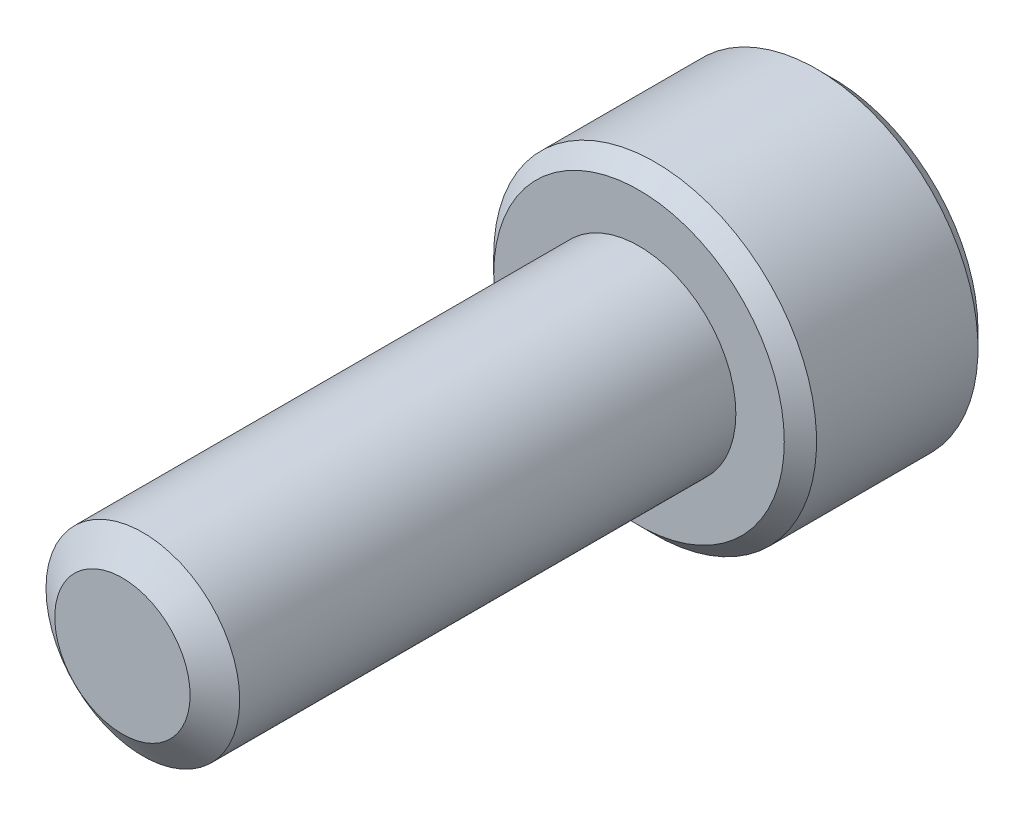
ISO-10303-21;
HEADER;
FILE_DESCRIPTION(('STEP AP214'),'2;1');
FILE_NAME('part.step','',(''),(''),'','','');
FILE_SCHEMA(('AUTOMOTIVE_DESIGN { 1 0 10303 214 1 1 1 1 }'));
ENDSEC;
DATA;
#1=APPLICATION_CONTEXT('core data for automotive mechanical design processes');
#2=APPLICATION_PROTOCOL_DEFINITION('international standard','automotive_design',2000,#1);
#3=PRODUCT_CONTEXT('',#1,'mechanical');
#4=PRODUCT('Part','Part','',(#3));
#5=PRODUCT_RELATED_PRODUCT_CATEGORY('part','',(#4));
#6=PRODUCT_DEFINITION_FORMATION('','',#4);
#7=PRODUCT_DEFINITION_CONTEXT('part definition',#1,'design');
#8=PRODUCT_DEFINITION('design','',#6,#7);
#9=PRODUCT_DEFINITION_SHAPE('','',#8);
#10=(LENGTH_UNIT() NAMED_UNIT(*) SI_UNIT(.MILLI.,.METRE.));
#11=(NAMED_UNIT(*) PLANE_ANGLE_UNIT() SI_UNIT($,.RADIAN.));
#12=(NAMED_UNIT(*) SI_UNIT($,.STERADIAN.) SOLID_ANGLE_UNIT());
#13=UNCERTAINTY_MEASURE_WITH_UNIT(LENGTH_MEASURE(1.E-05),#10,'distance_accuracy_value','');
#14=(GEOMETRIC_REPRESENTATION_CONTEXT(3) GLOBAL_UNCERTAINTY_ASSIGNED_CONTEXT((#13)) GLOBAL_UNIT_ASSIGNED_CONTEXT((#10,
#11,#12)) REPRESENTATION_CONTEXT('',''));
#15=CARTESIAN_POINT('',(0.,0.,0.));
#16=DIRECTION('',(0.,0.,1.));
#17=DIRECTION('',(1.,0.,0.));
#18=AXIS2_PLACEMENT_3D('',#15,#16,#17);
#19=CARTESIAN_POINT('',(0.,0.,-16.));
#20=DIRECTION('',(0.,0.,1.));
#21=DIRECTION('',(1.,0.,0.));
#22=AXIS2_PLACEMENT_3D('',#19,#20,#21);
#23=CYLINDRICAL_SURFACE('',#22,3.);
#24=CARTESIAN_POINT('',(0.,0.,-16.));
#25=DIRECTION('',(0.,0.,-1.));
#26=DIRECTION('',(-1.,0.,0.));
#27=AXIS2_PLACEMENT_3D('',#24,#25,#26);
#28=CIRCLE('',#27,3.);
#29=CARTESIAN_POINT('',(-3.,0.,-16.));
#30=VERTEX_POINT('',#29);
#31=EDGE_CURVE('E154',#30,#30,#28,.F.);
#32=ORIENTED_EDGE('',*,*,#31,.T.);
#33=EDGE_LOOP('',(#32));
#34=FACE_BOUND('',#33,.T.);
#35=CARTESIAN_POINT('',(0.,0.,-0.632650851713494));
#36=DIRECTION('',(0.,0.,1.));
#37=DIRECTION('',(1.,0.,0.));
#38=AXIS2_PLACEMENT_3D('',#35,#36,#37);
#39=CIRCLE('',#38,3.);
#40=CARTESIAN_POINT('',(3.,0.,-0.632650851713494));
#41=VERTEX_POINT('',#40);
#42=EDGE_CURVE('E171',#41,#41,#39,.T.);
#43=ORIENTED_EDGE('',*,*,#42,.F.);
#44=EDGE_LOOP('',(#43));
#45=FACE_BOUND('',#44,.T.);
#46=ADVANCED_FACE('F39',(#34,#45),#23,.T.);
#47=CARTESIAN_POINT('',(0.,0.,0.));
#48=DIRECTION('',(0.,0.,-1.));
#49=DIRECTION('',(-1.,0.,0.));
#50=AXIS2_PLACEMENT_3D('',#47,#48,#49);
#51=CONICAL_SURFACE('',#50,2.09648094716167,0.959931088596884);
#52=ORIENTED_EDGE('',*,*,#42,.T.);
#53=EDGE_LOOP('',(#52));
#54=FACE_BOUND('',#53,.T.);
#55=CARTESIAN_POINT('',(0.,0.,0.));
#56=DIRECTION('',(0.,0.,1.));
#57=DIRECTION('',(1.,0.,0.));
#58=AXIS2_PLACEMENT_3D('',#55,#56,#57);
#59=CIRCLE('',#58,2.09648094716167);
#60=CARTESIAN_POINT('',(2.09648094716167,0.,0.));
#61=VERTEX_POINT('',#60);
#62=EDGE_CURVE('E167',#61,#61,#59,.T.);
#63=ORIENTED_EDGE('',*,*,#62,.F.);
#64=EDGE_LOOP('',(#63));
#65=FACE_BOUND('',#64,.T.);
#66=ADVANCED_FACE('F220',(#54,#65),#51,.T.);
#67=CARTESIAN_POINT('',(0.,0.,0.));
#68=DIRECTION('',(0.,0.,1.));
#69=DIRECTION('',(1.,0.,0.));
#70=AXIS2_PLACEMENT_3D('',#67,#68,#69);
#71=PLANE('',#70);
#72=ORIENTED_EDGE('',*,*,#62,.T.);
#73=EDGE_LOOP('',(#72));
#74=FACE_BOUND('',#73,.T.);
#75=ADVANCED_FACE('F226',(#74),#71,.T.);
#76=CARTESIAN_POINT('',(0.,0.,-22.));
#77=DIRECTION('',(0.,0.,1.));
#78=DIRECTION('',(1.,0.,0.));
#79=AXIS2_PLACEMENT_3D('',#76,#77,#78);
#80=CYLINDRICAL_SURFACE('',#79,5.);
#81=CARTESIAN_POINT('',(0.,0.,-21.5));
#82=DIRECTION('',(0.,0.,-1.));
#83=DIRECTION('',(-1.,0.,0.));
#84=AXIS2_PLACEMENT_3D('',#81,#82,#83);
#85=CIRCLE('',#84,5.);
#86=CARTESIAN_POINT('',(-5.,0.,-21.5));
#87=VERTEX_POINT('',#86);
#88=EDGE_CURVE('E48',#87,#87,#85,.F.);
#89=ORIENTED_EDGE('',*,*,#88,.T.);
#90=EDGE_LOOP('',(#89));
#91=FACE_BOUND('',#90,.T.);
#92=CARTESIAN_POINT('',(0.,0.,-16.5));
#93=DIRECTION('',(0.,0.,-1.));
#94=DIRECTION('',(-1.,0.,0.));
#95=AXIS2_PLACEMENT_3D('',#92,#93,#94);
#96=CIRCLE('',#95,5.);
#97=CARTESIAN_POINT('',(-5.,0.,-16.5));
#98=VERTEX_POINT('',#97);
#99=EDGE_CURVE('E179',#98,#98,#96,.T.);
#100=ORIENTED_EDGE('',*,*,#99,.T.);
#101=EDGE_LOOP('',(#100));
#102=FACE_BOUND('',#101,.T.);
#103=ADVANCED_FACE('F186',(#91,#102),#80,.T.);
#104=CARTESIAN_POINT('',(0.,0.,-22.));
#105=DIRECTION('',(0.,0.,-1.));
#106=DIRECTION('',(-1.,0.,0.));
#107=AXIS2_PLACEMENT_3D('',#104,#105,#106);
#108=PLANE('',#107);
#109=CARTESIAN_POINT('',(0.,0.,-22.));
#110=DIRECTION('',(0.,0.,-1.));
#111=DIRECTION('',(-1.,0.,0.));
#112=AXIS2_PLACEMENT_3D('',#109,#110,#111);
#113=CIRCLE('',#112,4.5);
#114=CARTESIAN_POINT('',(-4.5,0.,-22.));
#115=VERTEX_POINT('',#114);
#116=EDGE_CURVE('E175',#115,#115,#113,.T.);
#117=ORIENTED_EDGE('',*,*,#116,.T.);
#118=EDGE_LOOP('',(#117));
#119=FACE_BOUND('',#118,.T.);
#120=DIRECTION('',(0.866025403784439,0.5,0.));
#121=VECTOR('',#120,1.);
#122=CARTESIAN_POINT('',(-2.5,1.44337567297406,-22.));
#123=LINE('',#122,#121);
#124=CARTESIAN_POINT('',(-2.5,1.44337567297406,-22.));
#125=VERTEX_POINT('',#124);
#126=CARTESIAN_POINT('',(0.,2.88675134594813,-22.));
#127=VERTEX_POINT('',#126);
#128=EDGE_CURVE('E55',#125,#127,#123,.T.);
#129=ORIENTED_EDGE('',*,*,#128,.F.);
#130=DIRECTION('',(0.,1.,0.));
#131=VECTOR('',#130,1.);
#132=CARTESIAN_POINT('',(-2.5,-1.44337567297406,-22.));
#133=LINE('',#132,#131);
#134=CARTESIAN_POINT('',(-2.5,-1.44337567297406,-22.));
#135=VERTEX_POINT('',#134);
#136=EDGE_CURVE('E148',#135,#125,#133,.T.);
#137=ORIENTED_EDGE('',*,*,#136,.F.);
#138=DIRECTION('',(-0.866025403784439,0.5,0.));
#139=VECTOR('',#138,1.);
#140=CARTESIAN_POINT('',(0.,-2.88675134594813,-22.));
#141=LINE('',#140,#139);
#142=CARTESIAN_POINT('',(0.,-2.88675134594813,-22.));
#143=VERTEX_POINT('',#142);
#144=EDGE_CURVE('E145',#143,#135,#141,.T.);
#145=ORIENTED_EDGE('',*,*,#144,.F.);
#146=DIRECTION('',(-0.866025403784439,-0.5,0.));
#147=VECTOR('',#146,1.);
#148=CARTESIAN_POINT('',(2.5,-1.44337567297407,-22.));
#149=LINE('',#148,#147);
#150=CARTESIAN_POINT('',(2.5,-1.44337567297407,-22.));
#151=VERTEX_POINT('',#150);
#152=EDGE_CURVE('E103',#151,#143,#149,.T.);
#153=ORIENTED_EDGE('',*,*,#152,.F.);
#154=DIRECTION('',(0.,-1.,0.));
#155=VECTOR('',#154,1.);
#156=CARTESIAN_POINT('',(2.5,1.44337567297406,-22.));
#157=LINE('',#156,#155);
#158=CARTESIAN_POINT('',(2.5,1.44337567297406,-22.));
#159=VERTEX_POINT('',#158);
#160=EDGE_CURVE('E139',#159,#151,#157,.T.);
#161=ORIENTED_EDGE('',*,*,#160,.F.);
#162=DIRECTION('',(0.866025403784439,-0.5,0.));
#163=VECTOR('',#162,1.);
#164=CARTESIAN_POINT('',(0.,2.88675134594813,-22.));
#165=LINE('',#164,#163);
#166=EDGE_CURVE('E135',#127,#159,#165,.T.);
#167=ORIENTED_EDGE('',*,*,#166,.F.);
#168=EDGE_LOOP('',(#129,#137,#145,#153,#161,#167));
#169=FACE_BOUND('',#168,.T.);
#170=ADVANCED_FACE('F194',(#119,#169),#108,.T.);
#171=CARTESIAN_POINT('',(0.,0.,-16.));
#172=DIRECTION('',(0.,0.,-1.));
#173=DIRECTION('',(-1.,0.,0.));
#174=AXIS2_PLACEMENT_3D('',#171,#172,#173);
#175=PLANE('',#174);
#176=CARTESIAN_POINT('',(0.,0.,-16.));
#177=DIRECTION('',(0.,0.,-1.));
#178=DIRECTION('',(-1.,0.,0.));
#179=AXIS2_PLACEMENT_3D('',#176,#177,#178);
#180=CIRCLE('',#179,4.5);
#181=CARTESIAN_POINT('',(-4.5,0.,-16.));
#182=VERTEX_POINT('',#181);
#183=EDGE_CURVE('E11',#182,#182,#180,.F.);
#184=ORIENTED_EDGE('',*,*,#183,.T.);
#185=EDGE_LOOP('',(#184));
#186=FACE_BOUND('',#185,.T.);
#187=ORIENTED_EDGE('',*,*,#31,.F.);
#188=EDGE_LOOP('',(#187));
#189=FACE_BOUND('',#188,.T.);
#190=ADVANCED_FACE('F197',(#186,#189),#175,.F.);
#191=CARTESIAN_POINT('',(-2.5,1.44337567297406,-18.25));
#192=DIRECTION('',(-0.5,0.866025403784439,0.));
#193=DIRECTION('',(-0.866025403784439,-0.5,0.));
#194=AXIS2_PLACEMENT_3D('',#191,#192,#193);
#195=PLANE('',#194);
#196=ORIENTED_EDGE('',*,*,#128,.T.);
#197=DIRECTION('',(0.,0.,-1.));
#198=VECTOR('',#197,1.);
#199=CARTESIAN_POINT('',(0.,2.88675134594813,-18.25));
#200=LINE('',#199,#198);
#201=CARTESIAN_POINT('',(0.,2.88675134594813,-18.25));
#202=VERTEX_POINT('',#201);
#203=EDGE_CURVE('E85',#202,#127,#200,.T.);
#204=ORIENTED_EDGE('',*,*,#203,.F.);
#205=DIRECTION('',(0.866025403784439,0.5,0.));
#206=VECTOR('',#205,1.);
#207=CARTESIAN_POINT('',(-2.5,1.44337567297406,-18.25));
#208=LINE('',#207,#206);
#209=CARTESIAN_POINT('',(-2.5,1.44337567297406,-18.25));
#210=VERTEX_POINT('',#209);
#211=EDGE_CURVE('E151',#210,#202,#208,.T.);
#212=ORIENTED_EDGE('',*,*,#211,.F.);
#213=DIRECTION('',(0.,0.,-1.));
#214=VECTOR('',#213,1.);
#215=CARTESIAN_POINT('',(-2.5,1.44337567297406,-18.25));
#216=LINE('',#215,#214);
#217=EDGE_CURVE('E63',#210,#125,#216,.T.);
#218=ORIENTED_EDGE('',*,*,#217,.T.);
#219=EDGE_LOOP('',(#196,#204,#212,#218));
#220=FACE_BOUND('',#219,.T.);
#221=ADVANCED_FACE('F207',(#220),#195,.F.);
#222=CARTESIAN_POINT('',(-2.5,-1.44337567297406,-18.25));
#223=DIRECTION('',(-1.,0.,0.));
#224=DIRECTION('',(0.,-1.,0.));
#225=AXIS2_PLACEMENT_3D('',#222,#223,#224);
#226=PLANE('',#225);
#227=ORIENTED_EDGE('',*,*,#136,.T.);
#228=ORIENTED_EDGE('',*,*,#217,.F.);
#229=DIRECTION('',(0.,1.,0.));
#230=VECTOR('',#229,1.);
#231=CARTESIAN_POINT('',(-2.5,-1.44337567297406,-18.25));
#232=LINE('',#231,#230);
#233=CARTESIAN_POINT('',(-2.5,-1.44337567297406,-18.25));
#234=VERTEX_POINT('',#233);
#235=EDGE_CURVE('E117',#234,#210,#232,.T.);
#236=ORIENTED_EDGE('',*,*,#235,.F.);
#237=DIRECTION('',(0.,0.,-1.));
#238=VECTOR('',#237,1.);
#239=CARTESIAN_POINT('',(-2.5,-1.44337567297406,-18.25));
#240=LINE('',#239,#238);
#241=EDGE_CURVE('E108',#234,#135,#240,.T.);
#242=ORIENTED_EDGE('',*,*,#241,.T.);
#243=EDGE_LOOP('',(#227,#228,#236,#242));
#244=FACE_BOUND('',#243,.T.);
#245=ADVANCED_FACE('F209',(#244),#226,.F.);
#246=CARTESIAN_POINT('',(0.,-2.88675134594813,-18.25));
#247=DIRECTION('',(-0.5,-0.866025403784439,0.));
#248=DIRECTION('',(0.866025403784439,-0.5,0.));
#249=AXIS2_PLACEMENT_3D('',#246,#247,#248);
#250=PLANE('',#249);
#251=ORIENTED_EDGE('',*,*,#144,.T.);
#252=ORIENTED_EDGE('',*,*,#241,.F.);
#253=DIRECTION('',(-0.866025403784439,0.5,0.));
#254=VECTOR('',#253,1.);
#255=CARTESIAN_POINT('',(0.,-2.88675134594813,-18.25));
#256=LINE('',#255,#254);
#257=CARTESIAN_POINT('',(0.,-2.88675134594813,-18.25));
#258=VERTEX_POINT('',#257);
#259=EDGE_CURVE('E112',#258,#234,#256,.T.);
#260=ORIENTED_EDGE('',*,*,#259,.F.);
#261=DIRECTION('',(0.,0.,-1.));
#262=VECTOR('',#261,1.);
#263=CARTESIAN_POINT('',(0.,-2.88675134594813,-18.25));
#264=LINE('',#263,#262);
#265=EDGE_CURVE('E96',#258,#143,#264,.T.);
#266=ORIENTED_EDGE('',*,*,#265,.T.);
#267=EDGE_LOOP('',(#251,#252,#260,#266));
#268=FACE_BOUND('',#267,.T.);
#269=ADVANCED_FACE('F113',(#268),#250,.F.);
#270=CARTESIAN_POINT('',(2.5,-1.44337567297407,-18.25));
#271=DIRECTION('',(0.5,-0.866025403784439,0.));
#272=DIRECTION('',(0.866025403784439,0.5,0.));
#273=AXIS2_PLACEMENT_3D('',#270,#271,#272);
#274=PLANE('',#273);
#275=ORIENTED_EDGE('',*,*,#152,.T.);
#276=ORIENTED_EDGE('',*,*,#265,.F.);
#277=DIRECTION('',(-0.866025403784439,-0.5,0.));
#278=VECTOR('',#277,1.);
#279=CARTESIAN_POINT('',(2.5,-1.44337567297407,-18.25));
#280=LINE('',#279,#278);
#281=CARTESIAN_POINT('',(2.5,-1.44337567297407,-18.25));
#282=VERTEX_POINT('',#281);
#283=EDGE_CURVE('E100',#282,#258,#280,.T.);
#284=ORIENTED_EDGE('',*,*,#283,.F.);
#285=DIRECTION('',(0.,0.,-1.));
#286=VECTOR('',#285,1.);
#287=CARTESIAN_POINT('',(2.5,-1.44337567297407,-18.25));
#288=LINE('',#287,#286);
#289=EDGE_CURVE('E109',#282,#151,#288,.T.);
#290=ORIENTED_EDGE('',*,*,#289,.T.);
#291=EDGE_LOOP('',(#275,#276,#284,#290));
#292=FACE_BOUND('',#291,.T.);
#293=ADVANCED_FACE('F98',(#292),#274,.F.);
#294=CARTESIAN_POINT('',(2.5,1.44337567297406,-18.25));
#295=DIRECTION('',(1.,0.,0.));
#296=DIRECTION('',(0.,0.,-1.));
#297=AXIS2_PLACEMENT_3D('',#294,#295,#296);
#298=PLANE('',#297);
#299=ORIENTED_EDGE('',*,*,#160,.T.);
#300=ORIENTED_EDGE('',*,*,#289,.F.);
#301=DIRECTION('',(0.,-1.,0.));
#302=VECTOR('',#301,1.);
#303=CARTESIAN_POINT('',(2.5,1.44337567297406,-18.25));
#304=LINE('',#303,#302);
#305=CARTESIAN_POINT('',(2.5,1.44337567297406,-18.25));
#306=VERTEX_POINT('',#305);
#307=EDGE_CURVE('E123',#306,#282,#304,.T.);
#308=ORIENTED_EDGE('',*,*,#307,.F.);
#309=DIRECTION('',(0.,0.,-1.));
#310=VECTOR('',#309,1.);
#311=CARTESIAN_POINT('',(2.5,1.44337567297406,-18.25));
#312=LINE('',#311,#310);
#313=EDGE_CURVE('E159',#306,#159,#312,.T.);
#314=ORIENTED_EDGE('',*,*,#313,.T.);
#315=EDGE_LOOP('',(#299,#300,#308,#314));
#316=FACE_BOUND('',#315,.T.);
#317=ADVANCED_FACE('F281',(#316),#298,.F.);
#318=CARTESIAN_POINT('',(0.,2.88675134594813,-18.25));
#319=DIRECTION('',(0.5,0.866025403784439,0.));
#320=DIRECTION('',(-0.866025403784439,0.5,0.));
#321=AXIS2_PLACEMENT_3D('',#318,#319,#320);
#322=PLANE('',#321);
#323=ORIENTED_EDGE('',*,*,#166,.T.);
#324=ORIENTED_EDGE('',*,*,#313,.F.);
#325=DIRECTION('',(0.866025403784439,-0.5,0.));
#326=VECTOR('',#325,1.);
#327=CARTESIAN_POINT('',(0.,2.88675134594813,-18.25));
#328=LINE('',#327,#326);
#329=EDGE_CURVE('E127',#202,#306,#328,.T.);
#330=ORIENTED_EDGE('',*,*,#329,.F.);
#331=ORIENTED_EDGE('',*,*,#203,.T.);
#332=EDGE_LOOP('',(#323,#324,#330,#331));
#333=FACE_BOUND('',#332,.T.);
#334=ADVANCED_FACE('F203',(#333),#322,.F.);
#335=CARTESIAN_POINT('',(2.5,4.33012701892219,-18.25));
#336=DIRECTION('',(0.,0.,-1.));
#337=DIRECTION('',(-1.,0.,0.));
#338=AXIS2_PLACEMENT_3D('',#335,#336,#337);
#339=PLANE('',#338);
#340=ORIENTED_EDGE('',*,*,#211,.T.);
#341=ORIENTED_EDGE('',*,*,#329,.T.);
#342=ORIENTED_EDGE('',*,*,#307,.T.);
#343=ORIENTED_EDGE('',*,*,#283,.T.);
#344=ORIENTED_EDGE('',*,*,#259,.T.);
#345=ORIENTED_EDGE('',*,*,#235,.T.);
#346=EDGE_LOOP('',(#340,#341,#342,#343,#344,#345));
#347=FACE_BOUND('',#346,.T.);
#348=ADVANCED_FACE('F120',(#347),#339,.T.);
#349=CARTESIAN_POINT('',(0.,0.,-22.));
#350=DIRECTION('',(0.,0.,1.));
#351=DIRECTION('',(1.,0.,0.));
#352=AXIS2_PLACEMENT_3D('',#349,#350,#351);
#353=CONICAL_SURFACE('',#352,4.5,0.785398163397444);
#354=ORIENTED_EDGE('',*,*,#88,.F.);
#355=EDGE_LOOP('',(#354));
#356=FACE_BOUND('',#355,.T.);
#357=ORIENTED_EDGE('',*,*,#116,.F.);
#358=EDGE_LOOP('',(#357));
#359=FACE_BOUND('',#358,.T.);
#360=ADVANCED_FACE('F189',(#356,#359),#353,.T.);
#361=CARTESIAN_POINT('',(0.,0.,-16.5));
#362=DIRECTION('',(0.,0.,-1.));
#363=DIRECTION('',(-1.,0.,0.));
#364=AXIS2_PLACEMENT_3D('',#361,#362,#363);
#365=CONICAL_SURFACE('',#364,5.,0.785398163397454);
#366=ORIENTED_EDGE('',*,*,#183,.F.);
#367=EDGE_LOOP('',(#366));
#368=FACE_BOUND('',#367,.T.);
#369=ORIENTED_EDGE('',*,*,#99,.F.);
#370=EDGE_LOOP('',(#369));
#371=FACE_BOUND('',#370,.T.);
#372=ADVANCED_FACE('F41',(#368,#371),#365,.T.);
#373=CLOSED_SHELL('',(#46,#66,#75,#103,#170,#190,#221,#245,#269,#293,#317,#334,#348,#360,#372));
#374=MANIFOLD_SOLID_BREP('B2',#373);
#375=ADVANCED_BREP_SHAPE_REPRESENTATION('',(#18,#374),#14);
#376=SHAPE_DEFINITION_REPRESENTATION(#9,#375);
ENDSEC;
END-ISO-10303-21;
